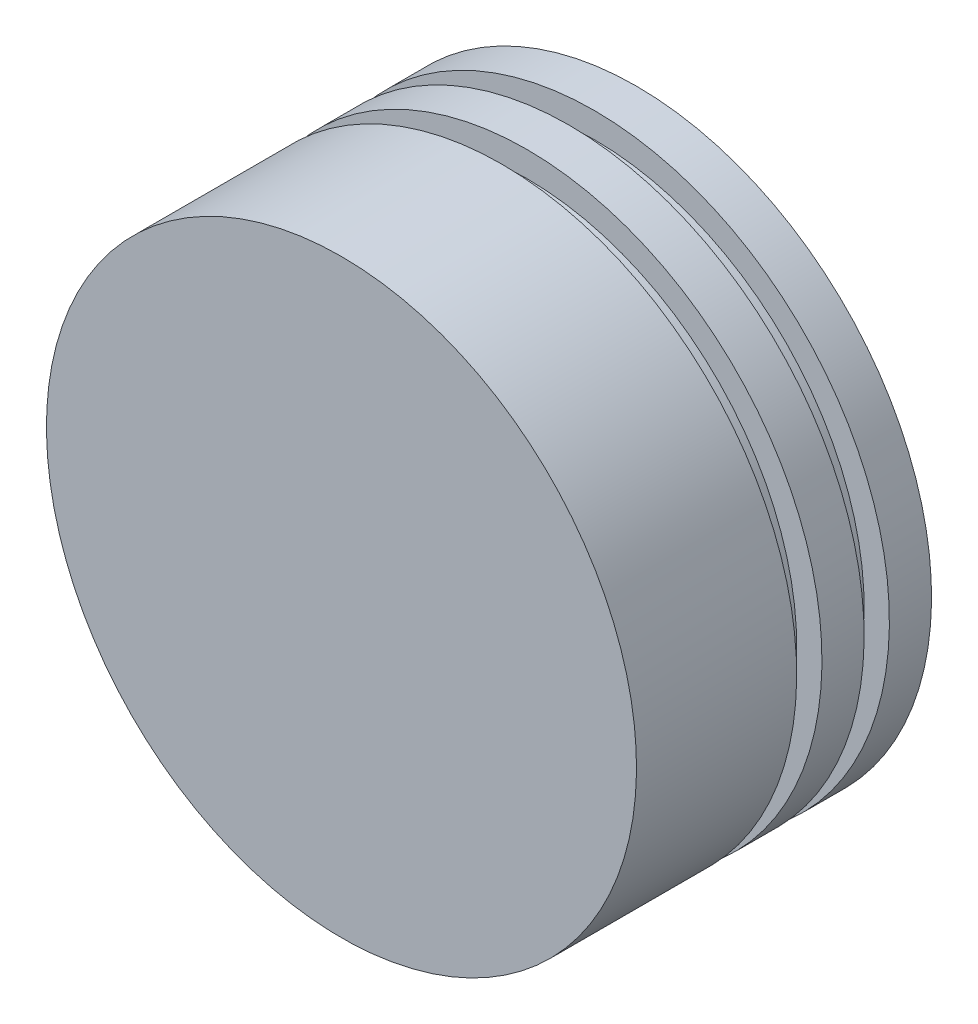
ISO-10303-21;
HEADER;
FILE_DESCRIPTION(('STEP AP214'),'2;1');
FILE_NAME('part.step','',(''),(''),'','','');
FILE_SCHEMA(('AUTOMOTIVE_DESIGN { 1 0 10303 214 1 1 1 1 }'));
ENDSEC;
DATA;
#1=APPLICATION_CONTEXT('core data for automotive mechanical design processes');
#2=APPLICATION_PROTOCOL_DEFINITION('international standard','automotive_design',2000,#1);
#3=PRODUCT_CONTEXT('',#1,'mechanical');
#4=PRODUCT('Part','Part','',(#3));
#5=PRODUCT_RELATED_PRODUCT_CATEGORY('part','',(#4));
#6=PRODUCT_DEFINITION_FORMATION('','',#4);
#7=PRODUCT_DEFINITION_CONTEXT('part definition',#1,'design');
#8=PRODUCT_DEFINITION('design','',#6,#7);
#9=PRODUCT_DEFINITION_SHAPE('','',#8);
#10=(LENGTH_UNIT() NAMED_UNIT(*) SI_UNIT(.MILLI.,.METRE.));
#11=(NAMED_UNIT(*) PLANE_ANGLE_UNIT() SI_UNIT($,.RADIAN.));
#12=(NAMED_UNIT(*) SI_UNIT($,.STERADIAN.) SOLID_ANGLE_UNIT());
#13=UNCERTAINTY_MEASURE_WITH_UNIT(LENGTH_MEASURE(1.E-05),#10,'distance_accuracy_value','');
#14=(GEOMETRIC_REPRESENTATION_CONTEXT(3) GLOBAL_UNCERTAINTY_ASSIGNED_CONTEXT((#13)) GLOBAL_UNIT_ASSIGNED_CONTEXT((#10,
#11,#12)) REPRESENTATION_CONTEXT('',''));
#15=CARTESIAN_POINT('',(0.,0.,0.));
#16=DIRECTION('',(0.,0.,1.));
#17=DIRECTION('',(1.,0.,0.));
#18=AXIS2_PLACEMENT_3D('',#15,#16,#17);
#19=CARTESIAN_POINT('',(0.,0.,0.));
#20=DIRECTION('',(0.,0.,-1.));
#21=DIRECTION('',(0.,1.,0.));
#22=AXIS2_PLACEMENT_3D('',#19,#20,#21);
#23=PLANE('',#22);
#24=CARTESIAN_POINT('',(0.,25.,0.));
#25=DIRECTION('',(0.,0.,-1.));
#26=DIRECTION('',(0.,1.,0.));
#27=AXIS2_PLACEMENT_3D('',#24,#25,#26);
#28=CIRCLE('',#27,35.);
#29=CARTESIAN_POINT('',(0.,60.,0.));
#30=VERTEX_POINT('',#29);
#31=EDGE_CURVE('E10',#30,#30,#28,.T.);
#32=ORIENTED_EDGE('',*,*,#31,.F.);
#33=EDGE_LOOP('',(#32));
#34=FACE_BOUND('',#33,.T.);
#35=ADVANCED_FACE('F31',(#34),#23,.F.);
#36=CARTESIAN_POINT('',(0.,25.,-35.));
#37=DIRECTION('',(0.,0.,-1.));
#38=DIRECTION('',(0.,1.,0.));
#39=AXIS2_PLACEMENT_3D('',#36,#37,#38);
#40=CYLINDRICAL_SURFACE('',#39,35.);
#41=CARTESIAN_POINT('',(0.,25.,-19.));
#42=DIRECTION('',(0.,0.,-1.));
#43=DIRECTION('',(0.,1.,0.));
#44=AXIS2_PLACEMENT_3D('',#41,#42,#43);
#45=CIRCLE('',#44,35.);
#46=CARTESIAN_POINT('',(0.,60.,-19.));
#47=VERTEX_POINT('',#46);
#48=EDGE_CURVE('E37',#47,#47,#45,.T.);
#49=ORIENTED_EDGE('',*,*,#48,.F.);
#50=EDGE_LOOP('',(#49));
#51=FACE_BOUND('',#50,.T.);
#52=ORIENTED_EDGE('',*,*,#31,.T.);
#53=EDGE_LOOP('',(#52));
#54=FACE_BOUND('',#53,.T.);
#55=ADVANCED_FACE('F133',(#51,#54),#40,.T.);
#56=CARTESIAN_POINT('',(0.,-6.99999999999999,-19.));
#57=DIRECTION('',(0.,0.,1.));
#58=DIRECTION('',(0.,-1.,0.));
#59=AXIS2_PLACEMENT_3D('',#56,#57,#58);
#60=PLANE('',#59);
#61=CARTESIAN_POINT('',(0.,25.,-19.));
#62=DIRECTION('',(0.,0.,-1.));
#63=DIRECTION('',(0.,1.,0.));
#64=AXIS2_PLACEMENT_3D('',#61,#62,#63);
#65=CIRCLE('',#64,32.);
#66=CARTESIAN_POINT('',(0.,57.,-19.));
#67=VERTEX_POINT('',#66);
#68=EDGE_CURVE('E41',#67,#67,#65,.T.);
#69=ORIENTED_EDGE('',*,*,#68,.F.);
#70=EDGE_LOOP('',(#69));
#71=FACE_BOUND('',#70,.T.);
#72=ORIENTED_EDGE('',*,*,#48,.T.);
#73=EDGE_LOOP('',(#72));
#74=FACE_BOUND('',#73,.T.);
#75=ADVANCED_FACE('F128',(#71,#74),#60,.F.);
#76=CARTESIAN_POINT('',(0.,25.,-35.));
#77=DIRECTION('',(0.,0.,-1.));
#78=DIRECTION('',(0.,1.,0.));
#79=AXIS2_PLACEMENT_3D('',#76,#77,#78);
#80=CYLINDRICAL_SURFACE('',#79,32.);
#81=CARTESIAN_POINT('',(0.,25.,-22.));
#82=DIRECTION('',(0.,0.,-1.));
#83=DIRECTION('',(0.,1.,0.));
#84=AXIS2_PLACEMENT_3D('',#81,#82,#83);
#85=CIRCLE('',#84,32.);
#86=CARTESIAN_POINT('',(0.,57.,-22.));
#87=VERTEX_POINT('',#86);
#88=EDGE_CURVE('E45',#87,#87,#85,.T.);
#89=ORIENTED_EDGE('',*,*,#88,.F.);
#90=EDGE_LOOP('',(#89));
#91=FACE_BOUND('',#90,.T.);
#92=ORIENTED_EDGE('',*,*,#68,.T.);
#93=EDGE_LOOP('',(#92));
#94=FACE_BOUND('',#93,.T.);
#95=ADVANCED_FACE('F122',(#91,#94),#80,.T.);
#96=CARTESIAN_POINT('',(0.,-9.99999999999999,-22.));
#97=DIRECTION('',(0.,0.,-1.));
#98=DIRECTION('',(0.,1.,0.));
#99=AXIS2_PLACEMENT_3D('',#96,#97,#98);
#100=PLANE('',#99);
#101=CARTESIAN_POINT('',(0.,25.,-22.));
#102=DIRECTION('',(0.,0.,-1.));
#103=DIRECTION('',(0.,1.,0.));
#104=AXIS2_PLACEMENT_3D('',#101,#102,#103);
#105=CIRCLE('',#104,35.);
#106=CARTESIAN_POINT('',(0.,60.,-22.));
#107=VERTEX_POINT('',#106);
#108=EDGE_CURVE('E50',#107,#107,#105,.T.);
#109=ORIENTED_EDGE('',*,*,#108,.F.);
#110=EDGE_LOOP('',(#109));
#111=FACE_BOUND('',#110,.T.);
#112=ORIENTED_EDGE('',*,*,#88,.T.);
#113=EDGE_LOOP('',(#112));
#114=FACE_BOUND('',#113,.T.);
#115=ADVANCED_FACE('F116',(#111,#114),#100,.F.);
#116=CARTESIAN_POINT('',(0.,25.,-35.));
#117=DIRECTION('',(0.,0.,-1.));
#118=DIRECTION('',(0.,1.,0.));
#119=AXIS2_PLACEMENT_3D('',#116,#117,#118);
#120=CYLINDRICAL_SURFACE('',#119,35.);
#121=CARTESIAN_POINT('',(0.,25.,-27.));
#122=DIRECTION('',(0.,0.,-1.));
#123=DIRECTION('',(0.,1.,0.));
#124=AXIS2_PLACEMENT_3D('',#121,#122,#123);
#125=CIRCLE('',#124,35.);
#126=CARTESIAN_POINT('',(0.,60.,-27.));
#127=VERTEX_POINT('',#126);
#128=EDGE_CURVE('E53',#127,#127,#125,.T.);
#129=ORIENTED_EDGE('',*,*,#128,.F.);
#130=EDGE_LOOP('',(#129));
#131=FACE_BOUND('',#130,.T.);
#132=ORIENTED_EDGE('',*,*,#108,.T.);
#133=EDGE_LOOP('',(#132));
#134=FACE_BOUND('',#133,.T.);
#135=ADVANCED_FACE('F110',(#131,#134),#120,.T.);
#136=CARTESIAN_POINT('',(0.,-7.,-27.));
#137=DIRECTION('',(0.,0.,1.));
#138=DIRECTION('',(0.,-1.,0.));
#139=AXIS2_PLACEMENT_3D('',#136,#137,#138);
#140=PLANE('',#139);
#141=CARTESIAN_POINT('',(0.,25.,-27.));
#142=DIRECTION('',(0.,0.,-1.));
#143=DIRECTION('',(0.,1.,0.));
#144=AXIS2_PLACEMENT_3D('',#141,#142,#143);
#145=CIRCLE('',#144,32.);
#146=CARTESIAN_POINT('',(0.,57.,-27.));
#147=VERTEX_POINT('',#146);
#148=EDGE_CURVE('E56',#147,#147,#145,.T.);
#149=ORIENTED_EDGE('',*,*,#148,.F.);
#150=EDGE_LOOP('',(#149));
#151=FACE_BOUND('',#150,.T.);
#152=ORIENTED_EDGE('',*,*,#128,.T.);
#153=EDGE_LOOP('',(#152));
#154=FACE_BOUND('',#153,.T.);
#155=ADVANCED_FACE('F104',(#151,#154),#140,.F.);
#156=CARTESIAN_POINT('',(0.,25.,-35.));
#157=DIRECTION('',(0.,0.,-1.));
#158=DIRECTION('',(0.,1.,0.));
#159=AXIS2_PLACEMENT_3D('',#156,#157,#158);
#160=CYLINDRICAL_SURFACE('',#159,32.);
#161=CARTESIAN_POINT('',(0.,25.,-30.));
#162=DIRECTION('',(0.,0.,-1.));
#163=DIRECTION('',(0.,1.,0.));
#164=AXIS2_PLACEMENT_3D('',#161,#162,#163);
#165=CIRCLE('',#164,32.);
#166=CARTESIAN_POINT('',(0.,57.,-30.));
#167=VERTEX_POINT('',#166);
#168=EDGE_CURVE('E59',#167,#167,#165,.T.);
#169=ORIENTED_EDGE('',*,*,#168,.F.);
#170=EDGE_LOOP('',(#169));
#171=FACE_BOUND('',#170,.T.);
#172=ORIENTED_EDGE('',*,*,#148,.T.);
#173=EDGE_LOOP('',(#172));
#174=FACE_BOUND('',#173,.T.);
#175=ADVANCED_FACE('F98',(#171,#174),#160,.T.);
#176=CARTESIAN_POINT('',(0.,-10.,-30.));
#177=DIRECTION('',(0.,0.,-1.));
#178=DIRECTION('',(0.,1.,0.));
#179=AXIS2_PLACEMENT_3D('',#176,#177,#178);
#180=PLANE('',#179);
#181=CARTESIAN_POINT('',(0.,25.,-30.));
#182=DIRECTION('',(0.,0.,-1.));
#183=DIRECTION('',(0.,1.,0.));
#184=AXIS2_PLACEMENT_3D('',#181,#182,#183);
#185=CIRCLE('',#184,35.);
#186=CARTESIAN_POINT('',(0.,60.,-30.));
#187=VERTEX_POINT('',#186);
#188=EDGE_CURVE('E62',#187,#187,#185,.T.);
#189=ORIENTED_EDGE('',*,*,#188,.F.);
#190=EDGE_LOOP('',(#189));
#191=FACE_BOUND('',#190,.T.);
#192=ORIENTED_EDGE('',*,*,#168,.T.);
#193=EDGE_LOOP('',(#192));
#194=FACE_BOUND('',#193,.T.);
#195=ADVANCED_FACE('F92',(#191,#194),#180,.F.);
#196=CARTESIAN_POINT('',(0.,25.,-35.));
#197=DIRECTION('',(0.,0.,-1.));
#198=DIRECTION('',(0.,1.,0.));
#199=AXIS2_PLACEMENT_3D('',#196,#197,#198);
#200=CYLINDRICAL_SURFACE('',#199,35.);
#201=CARTESIAN_POINT('',(0.,25.,-35.));
#202=DIRECTION('',(0.,0.,-1.));
#203=DIRECTION('',(0.,1.,0.));
#204=AXIS2_PLACEMENT_3D('',#201,#202,#203);
#205=CIRCLE('',#204,35.);
#206=CARTESIAN_POINT('',(0.,60.,-35.));
#207=VERTEX_POINT('',#206);
#208=EDGE_CURVE('E65',#207,#207,#205,.T.);
#209=ORIENTED_EDGE('',*,*,#208,.F.);
#210=EDGE_LOOP('',(#209));
#211=FACE_BOUND('',#210,.T.);
#212=ORIENTED_EDGE('',*,*,#188,.T.);
#213=EDGE_LOOP('',(#212));
#214=FACE_BOUND('',#213,.T.);
#215=ADVANCED_FACE('F86',(#211,#214),#200,.T.);
#216=CARTESIAN_POINT('',(0.,-10.,-35.));
#217=DIRECTION('',(0.,0.,1.));
#218=DIRECTION('',(0.,-1.,0.));
#219=AXIS2_PLACEMENT_3D('',#216,#217,#218);
#220=PLANE('',#219);
#221=CARTESIAN_POINT('',(0.,25.,-35.));
#222=DIRECTION('',(0.,0.,-1.));
#223=DIRECTION('',(0.,1.,0.));
#224=AXIS2_PLACEMENT_3D('',#221,#222,#223);
#225=CIRCLE('',#224,24.);
#226=CARTESIAN_POINT('',(0.,49.,-35.));
#227=VERTEX_POINT('',#226);
#228=EDGE_CURVE('E69',#227,#227,#225,.T.);
#229=ORIENTED_EDGE('',*,*,#228,.F.);
#230=EDGE_LOOP('',(#229));
#231=FACE_BOUND('',#230,.T.);
#232=ORIENTED_EDGE('',*,*,#208,.T.);
#233=EDGE_LOOP('',(#232));
#234=FACE_BOUND('',#233,.T.);
#235=ADVANCED_FACE('F80',(#231,#234),#220,.F.);
#236=CARTESIAN_POINT('',(0.,25.,-20.));
#237=DIRECTION('',(0.,0.,-1.));
#238=DIRECTION('',(0.,1.,0.));
#239=AXIS2_PLACEMENT_3D('',#236,#237,#238);
#240=CYLINDRICAL_SURFACE('',#239,24.);
#241=CARTESIAN_POINT('',(0.,25.,-20.));
#242=DIRECTION('',(0.,0.,-1.));
#243=DIRECTION('',(0.,1.,0.));
#244=AXIS2_PLACEMENT_3D('',#241,#242,#243);
#245=CIRCLE('',#244,24.);
#246=CARTESIAN_POINT('',(0.,49.,-20.));
#247=VERTEX_POINT('',#246);
#248=EDGE_CURVE('E68',#247,#247,#245,.T.);
#249=ORIENTED_EDGE('',*,*,#248,.F.);
#250=EDGE_LOOP('',(#249));
#251=FACE_BOUND('',#250,.T.);
#252=ORIENTED_EDGE('',*,*,#228,.T.);
#253=EDGE_LOOP('',(#252));
#254=FACE_BOUND('',#253,.T.);
#255=ADVANCED_FACE('F77',(#251,#254),#240,.F.);
#256=CARTESIAN_POINT('',(0.,25.,-20.));
#257=DIRECTION('',(0.,0.,-1.));
#258=DIRECTION('',(0.,1.,0.));
#259=AXIS2_PLACEMENT_3D('',#256,#257,#258);
#260=PLANE('',#259);
#261=ORIENTED_EDGE('',*,*,#248,.T.);
#262=EDGE_LOOP('',(#261));
#263=FACE_BOUND('',#262,.T.);
#264=ADVANCED_FACE('F75',(#263),#260,.T.);
#265=CLOSED_SHELL('',(#35,#55,#75,#95,#115,#135,#155,#175,#195,#215,#235,#255,#264));
#266=MANIFOLD_SOLID_BREP('B2',#265);
#267=ADVANCED_BREP_SHAPE_REPRESENTATION('',(#18,#266),#14);
#268=SHAPE_DEFINITION_REPRESENTATION(#9,#267);
ENDSEC;
END-ISO-10303-21;
